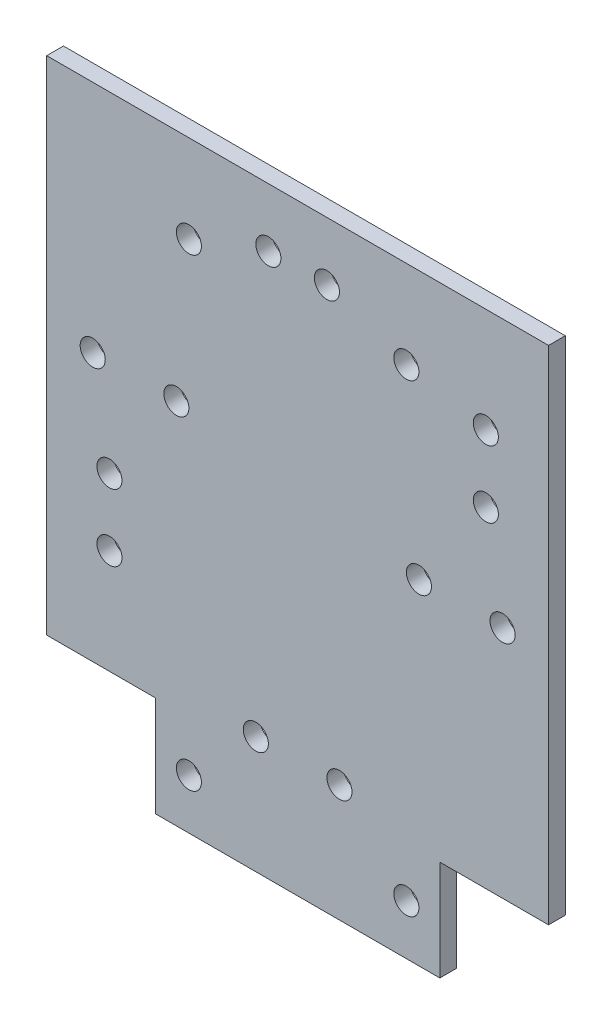
ISO-10303-21;
HEADER;
FILE_DESCRIPTION(('STEP AP214'),'2;1');
FILE_NAME('part.step','',(''),(''),'','','');
FILE_SCHEMA(('AUTOMOTIVE_DESIGN { 1 0 10303 214 1 1 1 1 }'));
ENDSEC;
DATA;
#1=APPLICATION_CONTEXT('core data for automotive mechanical design processes');
#2=APPLICATION_PROTOCOL_DEFINITION('international standard','automotive_design',2000,#1);
#3=PRODUCT_CONTEXT('',#1,'mechanical');
#4=PRODUCT('Part','Part','',(#3));
#5=PRODUCT_RELATED_PRODUCT_CATEGORY('part','',(#4));
#6=PRODUCT_DEFINITION_FORMATION('','',#4);
#7=PRODUCT_DEFINITION_CONTEXT('part definition',#1,'design');
#8=PRODUCT_DEFINITION('design','',#6,#7);
#9=PRODUCT_DEFINITION_SHAPE('','',#8);
#10=(LENGTH_UNIT() NAMED_UNIT(*) SI_UNIT(.MILLI.,.METRE.));
#11=(NAMED_UNIT(*) PLANE_ANGLE_UNIT() SI_UNIT($,.RADIAN.));
#12=(NAMED_UNIT(*) SI_UNIT($,.STERADIAN.) SOLID_ANGLE_UNIT());
#13=UNCERTAINTY_MEASURE_WITH_UNIT(LENGTH_MEASURE(1.E-05),#10,'distance_accuracy_value','');
#14=(GEOMETRIC_REPRESENTATION_CONTEXT(3) GLOBAL_UNCERTAINTY_ASSIGNED_CONTEXT((#13)) GLOBAL_UNIT_ASSIGNED_CONTEXT((#10,
#11,#12)) REPRESENTATION_CONTEXT('',''));
#15=CARTESIAN_POINT('',(0.,0.,0.));
#16=DIRECTION('',(0.,0.,1.));
#17=DIRECTION('',(1.,0.,0.));
#18=AXIS2_PLACEMENT_3D('',#15,#16,#17);
#19=CARTESIAN_POINT('',(5.26420796520805,-45.9554736842105,2.));
#20=DIRECTION('',(0.,0.,1.));
#21=DIRECTION('',(1.,0.,0.));
#22=AXIS2_PLACEMENT_3D('',#19,#20,#21);
#23=PLANE('',#22);
#24=CARTESIAN_POINT('',(20.764207965208,-13.9554736842105,2.));
#25=DIRECTION('',(0.,0.,1.));
#26=DIRECTION('',(1.,0.,0.));
#27=AXIS2_PLACEMENT_3D('',#24,#25,#26);
#28=CIRCLE('',#27,1.5);
#29=CARTESIAN_POINT('',(22.264207965208,-13.9554736842105,2.));
#30=VERTEX_POINT('',#29);
#31=EDGE_CURVE('E258',#30,#30,#28,.T.);
#32=ORIENTED_EDGE('',*,*,#31,.F.);
#33=EDGE_LOOP('',(#32));
#34=FACE_BOUND('',#33,.T.);
#35=CARTESIAN_POINT('',(22.2642079652081,-51.9554736842105,2.));
#36=DIRECTION('',(0.,0.,1.));
#37=DIRECTION('',(1.,0.,0.));
#38=AXIS2_PLACEMENT_3D('',#35,#36,#37);
#39=CIRCLE('',#38,1.5);
#40=CARTESIAN_POINT('',(23.7642079652081,-51.9554736842105,2.));
#41=VERTEX_POINT('',#40);
#42=EDGE_CURVE('E246',#41,#41,#39,.T.);
#43=ORIENTED_EDGE('',*,*,#42,.F.);
#44=EDGE_LOOP('',(#43));
#45=FACE_BOUND('',#44,.T.);
#46=CARTESIAN_POINT('',(49.764207965208,-17.9554736842105,2.));
#47=DIRECTION('',(0.,0.,1.));
#48=DIRECTION('',(1.,0.,0.));
#49=AXIS2_PLACEMENT_3D('',#46,#47,#48);
#50=CIRCLE('',#49,1.5);
#51=CARTESIAN_POINT('',(51.264207965208,-17.9554736842105,2.));
#52=VERTEX_POINT('',#51);
#53=EDGE_CURVE('E234',#52,#52,#50,.T.);
#54=ORIENTED_EDGE('',*,*,#53,.F.);
#55=EDGE_LOOP('',(#54));
#56=FACE_BOUND('',#55,.T.);
#57=CARTESIAN_POINT('',(22.264207965208,3.54452631578948,2.));
#58=DIRECTION('',(0.,0.,1.));
#59=DIRECTION('',(1.,0.,0.));
#60=AXIS2_PLACEMENT_3D('',#57,#58,#59);
#61=CIRCLE('',#60,1.50000000000002);
#62=CARTESIAN_POINT('',(23.7642079652081,3.54452631578948,2.));
#63=VERTEX_POINT('',#62);
#64=EDGE_CURVE('E222',#63,#63,#61,.T.);
#65=ORIENTED_EDGE('',*,*,#64,.F.);
#66=EDGE_LOOP('',(#65));
#67=FACE_BOUND('',#66,.T.);
#68=CARTESIAN_POINT('',(31.764207965208,7.04452631578948,2.));
#69=DIRECTION('',(0.,0.,1.));
#70=DIRECTION('',(1.,0.,0.));
#71=AXIS2_PLACEMENT_3D('',#68,#69,#70);
#72=CIRCLE('',#71,1.5);
#73=CARTESIAN_POINT('',(33.264207965208,7.04452631578948,2.));
#74=VERTEX_POINT('',#73);
#75=EDGE_CURVE('E210',#74,#74,#72,.T.);
#76=ORIENTED_EDGE('',*,*,#75,.F.);
#77=EDGE_LOOP('',(#76));
#78=FACE_BOUND('',#77,.T.);
#79=CARTESIAN_POINT('',(40.2642079652081,-43.9554736842105,2.));
#80=DIRECTION('',(0.,0.,1.));
#81=DIRECTION('',(1.,0.,0.));
#82=AXIS2_PLACEMENT_3D('',#79,#80,#81);
#83=CIRCLE('',#82,1.50000000000001);
#84=CARTESIAN_POINT('',(41.7642079652081,-43.9554736842105,2.));
#85=VERTEX_POINT('',#84);
#86=EDGE_CURVE('E198',#85,#85,#83,.T.);
#87=ORIENTED_EDGE('',*,*,#86,.F.);
#88=EDGE_LOOP('',(#87));
#89=FACE_BOUND('',#88,.T.);
#90=CARTESIAN_POINT('',(12.7642079652081,-33.4554736842105,2.));
#91=DIRECTION('',(0.,0.,1.));
#92=DIRECTION('',(1.,0.,0.));
#93=AXIS2_PLACEMENT_3D('',#90,#91,#92);
#94=CIRCLE('',#93,1.5);
#95=CARTESIAN_POINT('',(14.2642079652081,-33.4554736842105,2.));
#96=VERTEX_POINT('',#95);
#97=EDGE_CURVE('E186',#96,#96,#94,.T.);
#98=ORIENTED_EDGE('',*,*,#97,.F.);
#99=EDGE_LOOP('',(#98));
#100=FACE_BOUND('',#99,.T.);
#101=CARTESIAN_POINT('',(57.764207965208,1.54452631578949,2.));
#102=DIRECTION('',(0.,0.,1.));
#103=DIRECTION('',(1.,0.,0.));
#104=AXIS2_PLACEMENT_3D('',#101,#102,#103);
#105=CIRCLE('',#104,1.5);
#106=CARTESIAN_POINT('',(59.264207965208,1.54452631578949,2.));
#107=VERTEX_POINT('',#106);
#108=EDGE_CURVE('E132',#107,#107,#105,.T.);
#109=ORIENTED_EDGE('',*,*,#108,.F.);
#110=EDGE_LOOP('',(#109));
#111=FACE_BOUND('',#110,.T.);
#112=DIRECTION('',(0.,-1.,0.));
#113=VECTOR('',#112,1.);
#114=CARTESIAN_POINT('',(5.26420796520805,14.0445263157895,2.));
#115=LINE('',#114,#113);
#116=CARTESIAN_POINT('',(5.26420796520805,14.0445263157895,2.));
#117=VERTEX_POINT('',#116);
#118=CARTESIAN_POINT('',(5.26420796520805,-45.9554736842105,2.));
#119=VERTEX_POINT('',#118);
#120=EDGE_CURVE('E143',#117,#119,#115,.T.);
#121=ORIENTED_EDGE('',*,*,#120,.T.);
#122=DIRECTION('',(1.,0.,0.));
#123=VECTOR('',#122,1.);
#124=CARTESIAN_POINT('',(5.26420796520805,-45.9554736842105,2.));
#125=LINE('',#124,#123);
#126=CARTESIAN_POINT('',(18.2642079652081,-45.9554736842105,2.));
#127=VERTEX_POINT('',#126);
#128=EDGE_CURVE('E91',#119,#127,#125,.T.);
#129=ORIENTED_EDGE('',*,*,#128,.T.);
#130=DIRECTION('',(0.,-1.,0.));
#131=VECTOR('',#130,1.);
#132=CARTESIAN_POINT('',(18.2642079652081,-57.9554736842105,2.));
#133=LINE('',#132,#131);
#134=CARTESIAN_POINT('',(18.2642079652081,-57.9554736842105,2.));
#135=VERTEX_POINT('',#134);
#136=EDGE_CURVE('E158',#127,#135,#133,.T.);
#137=ORIENTED_EDGE('',*,*,#136,.T.);
#138=DIRECTION('',(1.,0.,0.));
#139=VECTOR('',#138,1.);
#140=CARTESIAN_POINT('',(18.2642079652081,-57.9554736842105,2.));
#141=LINE('',#140,#139);
#142=CARTESIAN_POINT('',(52.2642079652081,-57.9554736842105,2.));
#143=VERTEX_POINT('',#142);
#144=EDGE_CURVE('E171',#135,#143,#141,.T.);
#145=ORIENTED_EDGE('',*,*,#144,.T.);
#146=DIRECTION('',(0.,1.,0.));
#147=VECTOR('',#146,1.);
#148=CARTESIAN_POINT('',(52.2642079652081,-57.9554736842105,2.));
#149=LINE('',#148,#147);
#150=CARTESIAN_POINT('',(52.264207965208,-45.9554736842105,2.));
#151=VERTEX_POINT('',#150);
#152=EDGE_CURVE('E110',#143,#151,#149,.T.);
#153=ORIENTED_EDGE('',*,*,#152,.T.);
#154=DIRECTION('',(1.,0.,0.));
#155=VECTOR('',#154,1.);
#156=CARTESIAN_POINT('',(65.264207965208,-45.9554736842105,2.));
#157=LINE('',#156,#155);
#158=CARTESIAN_POINT('',(65.264207965208,-45.9554736842105,2.));
#159=VERTEX_POINT('',#158);
#160=EDGE_CURVE('E104',#151,#159,#157,.T.);
#161=ORIENTED_EDGE('',*,*,#160,.T.);
#162=DIRECTION('',(0.,1.,0.));
#163=VECTOR('',#162,1.);
#164=CARTESIAN_POINT('',(65.264207965208,14.0445263157895,2.));
#165=LINE('',#164,#163);
#166=CARTESIAN_POINT('',(65.264207965208,14.0445263157895,2.));
#167=VERTEX_POINT('',#166);
#168=EDGE_CURVE('E108',#159,#167,#165,.T.);
#169=ORIENTED_EDGE('',*,*,#168,.T.);
#170=DIRECTION('',(-1.,0.,0.));
#171=VECTOR('',#170,1.);
#172=CARTESIAN_POINT('',(5.26420796520805,14.0445263157895,2.));
#173=LINE('',#172,#171);
#174=EDGE_CURVE('E48',#167,#117,#173,.T.);
#175=ORIENTED_EDGE('',*,*,#174,.T.);
#176=EDGE_LOOP('',(#121,#129,#137,#145,#153,#161,#169,#175));
#177=FACE_BOUND('',#176,.T.);
#178=CARTESIAN_POINT('',(57.7642079652081,-6.45547368421051,2.));
#179=DIRECTION('',(0.,0.,1.));
#180=DIRECTION('',(1.,0.,0.));
#181=AXIS2_PLACEMENT_3D('',#178,#179,#180);
#182=CIRCLE('',#181,1.5);
#183=CARTESIAN_POINT('',(59.2642079652081,-6.45547368421051,2.));
#184=VERTEX_POINT('',#183);
#185=EDGE_CURVE('E180',#184,#184,#182,.T.);
#186=ORIENTED_EDGE('',*,*,#185,.F.);
#187=EDGE_LOOP('',(#186));
#188=FACE_BOUND('',#187,.T.);
#189=CARTESIAN_POINT('',(12.7642079652081,-25.4554736842105,2.));
#190=DIRECTION('',(0.,0.,1.));
#191=DIRECTION('',(1.,0.,0.));
#192=AXIS2_PLACEMENT_3D('',#189,#190,#191);
#193=CIRCLE('',#192,1.5);
#194=CARTESIAN_POINT('',(14.2642079652081,-25.4554736842105,2.));
#195=VERTEX_POINT('',#194);
#196=EDGE_CURVE('E192',#195,#195,#193,.T.);
#197=ORIENTED_EDGE('',*,*,#196,.F.);
#198=EDGE_LOOP('',(#197));
#199=FACE_BOUND('',#198,.T.);
#200=CARTESIAN_POINT('',(30.264207965208,-43.9554736842105,2.));
#201=DIRECTION('',(0.,0.,1.));
#202=DIRECTION('',(1.,0.,0.));
#203=AXIS2_PLACEMENT_3D('',#200,#201,#202);
#204=CIRCLE('',#203,1.5);
#205=CARTESIAN_POINT('',(31.764207965208,-43.9554736842105,2.));
#206=VERTEX_POINT('',#205);
#207=EDGE_CURVE('E204',#206,#206,#204,.T.);
#208=ORIENTED_EDGE('',*,*,#207,.F.);
#209=EDGE_LOOP('',(#208));
#210=FACE_BOUND('',#209,.T.);
#211=CARTESIAN_POINT('',(38.764207965208,7.04452631578948,2.));
#212=DIRECTION('',(0.,0.,1.));
#213=DIRECTION('',(1.,0.,0.));
#214=AXIS2_PLACEMENT_3D('',#211,#212,#213);
#215=CIRCLE('',#214,1.5);
#216=CARTESIAN_POINT('',(40.264207965208,7.04452631578948,2.));
#217=VERTEX_POINT('',#216);
#218=EDGE_CURVE('E216',#217,#217,#215,.T.);
#219=ORIENTED_EDGE('',*,*,#218,.F.);
#220=EDGE_LOOP('',(#219));
#221=FACE_BOUND('',#220,.T.);
#222=CARTESIAN_POINT('',(48.264207965208,3.54452631578948,2.));
#223=DIRECTION('',(0.,0.,1.));
#224=DIRECTION('',(1.,0.,0.));
#225=AXIS2_PLACEMENT_3D('',#222,#223,#224);
#226=CIRCLE('',#225,1.50000000000002);
#227=CARTESIAN_POINT('',(49.7642079652081,3.54452631578948,2.));
#228=VERTEX_POINT('',#227);
#229=EDGE_CURVE('E228',#228,#228,#226,.T.);
#230=ORIENTED_EDGE('',*,*,#229,.F.);
#231=EDGE_LOOP('',(#230));
#232=FACE_BOUND('',#231,.T.);
#233=CARTESIAN_POINT('',(48.2642079652081,-51.9554736842105,2.));
#234=DIRECTION('',(0.,0.,1.));
#235=DIRECTION('',(1.,0.,0.));
#236=AXIS2_PLACEMENT_3D('',#233,#234,#235);
#237=CIRCLE('',#236,1.5);
#238=CARTESIAN_POINT('',(49.7642079652081,-51.9554736842105,2.));
#239=VERTEX_POINT('',#238);
#240=EDGE_CURVE('E240',#239,#239,#237,.T.);
#241=ORIENTED_EDGE('',*,*,#240,.F.);
#242=EDGE_LOOP('',(#241));
#243=FACE_BOUND('',#242,.T.);
#244=CARTESIAN_POINT('',(59.764207965208,-17.9554736842105,2.));
#245=DIRECTION('',(0.,0.,1.));
#246=DIRECTION('',(1.,0.,0.));
#247=AXIS2_PLACEMENT_3D('',#244,#245,#246);
#248=CIRCLE('',#247,1.5);
#249=CARTESIAN_POINT('',(61.264207965208,-17.9554736842105,2.));
#250=VERTEX_POINT('',#249);
#251=EDGE_CURVE('E252',#250,#250,#248,.T.);
#252=ORIENTED_EDGE('',*,*,#251,.F.);
#253=EDGE_LOOP('',(#252));
#254=FACE_BOUND('',#253,.T.);
#255=CARTESIAN_POINT('',(10.764207965208,-13.9554736842105,2.));
#256=DIRECTION('',(0.,0.,1.));
#257=DIRECTION('',(1.,0.,0.));
#258=AXIS2_PLACEMENT_3D('',#255,#256,#257);
#259=CIRCLE('',#258,1.5);
#260=CARTESIAN_POINT('',(12.264207965208,-13.9554736842105,2.));
#261=VERTEX_POINT('',#260);
#262=EDGE_CURVE('E264',#261,#261,#259,.T.);
#263=ORIENTED_EDGE('',*,*,#262,.F.);
#264=EDGE_LOOP('',(#263));
#265=FACE_BOUND('',#264,.T.);
#266=ADVANCED_FACE('F31',(#34,#45,#56,#67,#78,#89,#100,#111,#177,#188,#199,#210,#221,#232,#243,
#254,#265),#23,.T.);
#267=CARTESIAN_POINT('',(5.26420796520805,-45.9554736842105,0.));
#268=DIRECTION('',(0.,0.,1.));
#269=DIRECTION('',(1.,0.,0.));
#270=AXIS2_PLACEMENT_3D('',#267,#268,#269);
#271=PLANE('',#270);
#272=CARTESIAN_POINT('',(20.764207965208,-13.9554736842105,0.));
#273=DIRECTION('',(0.,0.,1.));
#274=DIRECTION('',(1.,0.,0.));
#275=AXIS2_PLACEMENT_3D('',#272,#273,#274);
#276=CIRCLE('',#275,1.5);
#277=CARTESIAN_POINT('',(22.264207965208,-13.9554736842105,0.));
#278=VERTEX_POINT('',#277);
#279=EDGE_CURVE('E261',#278,#278,#276,.T.);
#280=ORIENTED_EDGE('',*,*,#279,.T.);
#281=EDGE_LOOP('',(#280));
#282=FACE_BOUND('',#281,.T.);
#283=CARTESIAN_POINT('',(22.2642079652081,-51.9554736842105,0.));
#284=DIRECTION('',(0.,0.,1.));
#285=DIRECTION('',(1.,0.,0.));
#286=AXIS2_PLACEMENT_3D('',#283,#284,#285);
#287=CIRCLE('',#286,1.5);
#288=CARTESIAN_POINT('',(23.7642079652081,-51.9554736842105,0.));
#289=VERTEX_POINT('',#288);
#290=EDGE_CURVE('E249',#289,#289,#287,.T.);
#291=ORIENTED_EDGE('',*,*,#290,.T.);
#292=EDGE_LOOP('',(#291));
#293=FACE_BOUND('',#292,.T.);
#294=CARTESIAN_POINT('',(49.764207965208,-17.9554736842105,0.));
#295=DIRECTION('',(0.,0.,1.));
#296=DIRECTION('',(1.,0.,0.));
#297=AXIS2_PLACEMENT_3D('',#294,#295,#296);
#298=CIRCLE('',#297,1.5);
#299=CARTESIAN_POINT('',(51.264207965208,-17.9554736842105,0.));
#300=VERTEX_POINT('',#299);
#301=EDGE_CURVE('E237',#300,#300,#298,.T.);
#302=ORIENTED_EDGE('',*,*,#301,.T.);
#303=EDGE_LOOP('',(#302));
#304=FACE_BOUND('',#303,.T.);
#305=CARTESIAN_POINT('',(22.264207965208,3.54452631578948,0.));
#306=DIRECTION('',(0.,0.,1.));
#307=DIRECTION('',(1.,0.,0.));
#308=AXIS2_PLACEMENT_3D('',#305,#306,#307);
#309=CIRCLE('',#308,1.50000000000002);
#310=CARTESIAN_POINT('',(23.7642079652081,3.54452631578948,0.));
#311=VERTEX_POINT('',#310);
#312=EDGE_CURVE('E225',#311,#311,#309,.T.);
#313=ORIENTED_EDGE('',*,*,#312,.T.);
#314=EDGE_LOOP('',(#313));
#315=FACE_BOUND('',#314,.T.);
#316=CARTESIAN_POINT('',(31.764207965208,7.04452631578948,0.));
#317=DIRECTION('',(0.,0.,1.));
#318=DIRECTION('',(1.,0.,0.));
#319=AXIS2_PLACEMENT_3D('',#316,#317,#318);
#320=CIRCLE('',#319,1.5);
#321=CARTESIAN_POINT('',(33.264207965208,7.04452631578948,0.));
#322=VERTEX_POINT('',#321);
#323=EDGE_CURVE('E213',#322,#322,#320,.T.);
#324=ORIENTED_EDGE('',*,*,#323,.T.);
#325=EDGE_LOOP('',(#324));
#326=FACE_BOUND('',#325,.T.);
#327=CARTESIAN_POINT('',(40.2642079652081,-43.9554736842105,0.));
#328=DIRECTION('',(0.,0.,1.));
#329=DIRECTION('',(1.,0.,0.));
#330=AXIS2_PLACEMENT_3D('',#327,#328,#329);
#331=CIRCLE('',#330,1.50000000000001);
#332=CARTESIAN_POINT('',(41.7642079652081,-43.9554736842105,0.));
#333=VERTEX_POINT('',#332);
#334=EDGE_CURVE('E201',#333,#333,#331,.T.);
#335=ORIENTED_EDGE('',*,*,#334,.T.);
#336=EDGE_LOOP('',(#335));
#337=FACE_BOUND('',#336,.T.);
#338=CARTESIAN_POINT('',(12.7642079652081,-33.4554736842105,0.));
#339=DIRECTION('',(0.,0.,1.));
#340=DIRECTION('',(1.,0.,0.));
#341=AXIS2_PLACEMENT_3D('',#338,#339,#340);
#342=CIRCLE('',#341,1.5);
#343=CARTESIAN_POINT('',(14.2642079652081,-33.4554736842105,0.));
#344=VERTEX_POINT('',#343);
#345=EDGE_CURVE('E189',#344,#344,#342,.T.);
#346=ORIENTED_EDGE('',*,*,#345,.T.);
#347=EDGE_LOOP('',(#346));
#348=FACE_BOUND('',#347,.T.);
#349=CARTESIAN_POINT('',(57.764207965208,1.54452631578949,0.));
#350=DIRECTION('',(0.,0.,1.));
#351=DIRECTION('',(1.,0.,0.));
#352=AXIS2_PLACEMENT_3D('',#349,#350,#351);
#353=CIRCLE('',#352,1.5);
#354=CARTESIAN_POINT('',(59.264207965208,1.54452631578949,0.));
#355=VERTEX_POINT('',#354);
#356=EDGE_CURVE('E177',#355,#355,#353,.T.);
#357=ORIENTED_EDGE('',*,*,#356,.T.);
#358=EDGE_LOOP('',(#357));
#359=FACE_BOUND('',#358,.T.);
#360=DIRECTION('',(0.,-1.,0.));
#361=VECTOR('',#360,1.);
#362=CARTESIAN_POINT('',(5.26420796520805,14.0445263157895,0.));
#363=LINE('',#362,#361);
#364=CARTESIAN_POINT('',(5.26420796520805,14.0445263157895,0.));
#365=VERTEX_POINT('',#364);
#366=CARTESIAN_POINT('',(5.26420796520805,-45.9554736842105,0.));
#367=VERTEX_POINT('',#366);
#368=EDGE_CURVE('E128',#365,#367,#363,.T.);
#369=ORIENTED_EDGE('',*,*,#368,.F.);
#370=DIRECTION('',(-1.,0.,0.));
#371=VECTOR('',#370,1.);
#372=CARTESIAN_POINT('',(5.26420796520805,14.0445263157895,0.));
#373=LINE('',#372,#371);
#374=CARTESIAN_POINT('',(65.264207965208,14.0445263157895,0.));
#375=VERTEX_POINT('',#374);
#376=EDGE_CURVE('E83',#375,#365,#373,.T.);
#377=ORIENTED_EDGE('',*,*,#376,.F.);
#378=DIRECTION('',(0.,1.,0.));
#379=VECTOR('',#378,1.);
#380=CARTESIAN_POINT('',(65.264207965208,14.0445263157895,0.));
#381=LINE('',#380,#379);
#382=CARTESIAN_POINT('',(65.264207965208,-45.9554736842105,0.));
#383=VERTEX_POINT('',#382);
#384=EDGE_CURVE('E77',#383,#375,#381,.T.);
#385=ORIENTED_EDGE('',*,*,#384,.F.);
#386=DIRECTION('',(1.,0.,0.));
#387=VECTOR('',#386,1.);
#388=CARTESIAN_POINT('',(65.264207965208,-45.9554736842105,0.));
#389=LINE('',#388,#387);
#390=CARTESIAN_POINT('',(52.264207965208,-45.9554736842105,0.));
#391=VERTEX_POINT('',#390);
#392=EDGE_CURVE('E118',#391,#383,#389,.T.);
#393=ORIENTED_EDGE('',*,*,#392,.F.);
#394=DIRECTION('',(0.,1.,0.));
#395=VECTOR('',#394,1.);
#396=CARTESIAN_POINT('',(52.2642079652081,-57.9554736842105,0.));
#397=LINE('',#396,#395);
#398=CARTESIAN_POINT('',(52.2642079652081,-57.9554736842105,0.));
#399=VERTEX_POINT('',#398);
#400=EDGE_CURVE('E138',#399,#391,#397,.T.);
#401=ORIENTED_EDGE('',*,*,#400,.F.);
#402=DIRECTION('',(1.,0.,0.));
#403=VECTOR('',#402,1.);
#404=CARTESIAN_POINT('',(18.2642079652081,-57.9554736842105,0.));
#405=LINE('',#404,#403);
#406=CARTESIAN_POINT('',(18.2642079652081,-57.9554736842105,0.));
#407=VERTEX_POINT('',#406);
#408=EDGE_CURVE('E136',#407,#399,#405,.T.);
#409=ORIENTED_EDGE('',*,*,#408,.F.);
#410=DIRECTION('',(0.,-1.,0.));
#411=VECTOR('',#410,1.);
#412=CARTESIAN_POINT('',(18.2642079652081,-57.9554736842105,0.));
#413=LINE('',#412,#411);
#414=CARTESIAN_POINT('',(18.2642079652081,-45.9554736842105,0.));
#415=VERTEX_POINT('',#414);
#416=EDGE_CURVE('E134',#415,#407,#413,.T.);
#417=ORIENTED_EDGE('',*,*,#416,.F.);
#418=DIRECTION('',(1.,0.,0.));
#419=VECTOR('',#418,1.);
#420=CARTESIAN_POINT('',(5.26420796520805,-45.9554736842105,0.));
#421=LINE('',#420,#419);
#422=EDGE_CURVE('E131',#367,#415,#421,.T.);
#423=ORIENTED_EDGE('',*,*,#422,.F.);
#424=EDGE_LOOP('',(#369,#377,#385,#393,#401,#409,#417,#423));
#425=FACE_BOUND('',#424,.T.);
#426=CARTESIAN_POINT('',(57.7642079652081,-6.45547368421051,0.));
#427=DIRECTION('',(0.,0.,1.));
#428=DIRECTION('',(1.,0.,0.));
#429=AXIS2_PLACEMENT_3D('',#426,#427,#428);
#430=CIRCLE('',#429,1.5);
#431=CARTESIAN_POINT('',(59.2642079652081,-6.45547368421051,0.));
#432=VERTEX_POINT('',#431);
#433=EDGE_CURVE('E183',#432,#432,#430,.T.);
#434=ORIENTED_EDGE('',*,*,#433,.T.);
#435=EDGE_LOOP('',(#434));
#436=FACE_BOUND('',#435,.T.);
#437=CARTESIAN_POINT('',(12.7642079652081,-25.4554736842105,0.));
#438=DIRECTION('',(0.,0.,1.));
#439=DIRECTION('',(1.,0.,0.));
#440=AXIS2_PLACEMENT_3D('',#437,#438,#439);
#441=CIRCLE('',#440,1.5);
#442=CARTESIAN_POINT('',(14.2642079652081,-25.4554736842105,0.));
#443=VERTEX_POINT('',#442);
#444=EDGE_CURVE('E195',#443,#443,#441,.T.);
#445=ORIENTED_EDGE('',*,*,#444,.T.);
#446=EDGE_LOOP('',(#445));
#447=FACE_BOUND('',#446,.T.);
#448=CARTESIAN_POINT('',(30.264207965208,-43.9554736842105,0.));
#449=DIRECTION('',(0.,0.,1.));
#450=DIRECTION('',(1.,0.,0.));
#451=AXIS2_PLACEMENT_3D('',#448,#449,#450);
#452=CIRCLE('',#451,1.5);
#453=CARTESIAN_POINT('',(31.764207965208,-43.9554736842105,0.));
#454=VERTEX_POINT('',#453);
#455=EDGE_CURVE('E207',#454,#454,#452,.T.);
#456=ORIENTED_EDGE('',*,*,#455,.T.);
#457=EDGE_LOOP('',(#456));
#458=FACE_BOUND('',#457,.T.);
#459=CARTESIAN_POINT('',(38.764207965208,7.04452631578948,0.));
#460=DIRECTION('',(0.,0.,1.));
#461=DIRECTION('',(1.,0.,0.));
#462=AXIS2_PLACEMENT_3D('',#459,#460,#461);
#463=CIRCLE('',#462,1.5);
#464=CARTESIAN_POINT('',(40.264207965208,7.04452631578948,0.));
#465=VERTEX_POINT('',#464);
#466=EDGE_CURVE('E219',#465,#465,#463,.T.);
#467=ORIENTED_EDGE('',*,*,#466,.T.);
#468=EDGE_LOOP('',(#467));
#469=FACE_BOUND('',#468,.T.);
#470=CARTESIAN_POINT('',(48.264207965208,3.54452631578948,0.));
#471=DIRECTION('',(0.,0.,1.));
#472=DIRECTION('',(1.,0.,0.));
#473=AXIS2_PLACEMENT_3D('',#470,#471,#472);
#474=CIRCLE('',#473,1.50000000000002);
#475=CARTESIAN_POINT('',(49.7642079652081,3.54452631578948,0.));
#476=VERTEX_POINT('',#475);
#477=EDGE_CURVE('E231',#476,#476,#474,.T.);
#478=ORIENTED_EDGE('',*,*,#477,.T.);
#479=EDGE_LOOP('',(#478));
#480=FACE_BOUND('',#479,.T.);
#481=CARTESIAN_POINT('',(48.2642079652081,-51.9554736842105,0.));
#482=DIRECTION('',(0.,0.,1.));
#483=DIRECTION('',(1.,0.,0.));
#484=AXIS2_PLACEMENT_3D('',#481,#482,#483);
#485=CIRCLE('',#484,1.5);
#486=CARTESIAN_POINT('',(49.7642079652081,-51.9554736842105,0.));
#487=VERTEX_POINT('',#486);
#488=EDGE_CURVE('E243',#487,#487,#485,.T.);
#489=ORIENTED_EDGE('',*,*,#488,.T.);
#490=EDGE_LOOP('',(#489));
#491=FACE_BOUND('',#490,.T.);
#492=CARTESIAN_POINT('',(59.764207965208,-17.9554736842105,0.));
#493=DIRECTION('',(0.,0.,1.));
#494=DIRECTION('',(1.,0.,0.));
#495=AXIS2_PLACEMENT_3D('',#492,#493,#494);
#496=CIRCLE('',#495,1.5);
#497=CARTESIAN_POINT('',(61.264207965208,-17.9554736842105,0.));
#498=VERTEX_POINT('',#497);
#499=EDGE_CURVE('E255',#498,#498,#496,.T.);
#500=ORIENTED_EDGE('',*,*,#499,.T.);
#501=EDGE_LOOP('',(#500));
#502=FACE_BOUND('',#501,.T.);
#503=CARTESIAN_POINT('',(10.764207965208,-13.9554736842105,0.));
#504=DIRECTION('',(0.,0.,1.));
#505=DIRECTION('',(1.,0.,0.));
#506=AXIS2_PLACEMENT_3D('',#503,#504,#505);
#507=CIRCLE('',#506,1.5);
#508=CARTESIAN_POINT('',(12.264207965208,-13.9554736842105,0.));
#509=VERTEX_POINT('',#508);
#510=EDGE_CURVE('E267',#509,#509,#507,.T.);
#511=ORIENTED_EDGE('',*,*,#510,.T.);
#512=EDGE_LOOP('',(#511));
#513=FACE_BOUND('',#512,.T.);
#514=ADVANCED_FACE('F162',(#282,#293,#304,#315,#326,#337,#348,#359,#425,#436,#447,#458,#469,
#480,#491,#502,#513),#271,.F.);
#515=CARTESIAN_POINT('',(5.26420796520805,14.0445263157895,2.));
#516=DIRECTION('',(1.,0.,0.));
#517=DIRECTION('',(0.,1.,0.));
#518=AXIS2_PLACEMENT_3D('',#515,#516,#517);
#519=PLANE('',#518);
#520=ORIENTED_EDGE('',*,*,#368,.T.);
#521=DIRECTION('',(0.,0.,-1.));
#522=VECTOR('',#521,1.);
#523=CARTESIAN_POINT('',(5.26420796520805,-45.9554736842105,2.));
#524=LINE('',#523,#522);
#525=EDGE_CURVE('E11',#119,#367,#524,.T.);
#526=ORIENTED_EDGE('',*,*,#525,.F.);
#527=ORIENTED_EDGE('',*,*,#120,.F.);
#528=DIRECTION('',(0.,0.,-1.));
#529=VECTOR('',#528,1.);
#530=CARTESIAN_POINT('',(5.26420796520805,14.0445263157895,2.));
#531=LINE('',#530,#529);
#532=EDGE_CURVE('E124',#117,#365,#531,.T.);
#533=ORIENTED_EDGE('',*,*,#532,.T.);
#534=EDGE_LOOP('',(#520,#526,#527,#533));
#535=FACE_BOUND('',#534,.T.);
#536=ADVANCED_FACE('F33',(#535),#519,.F.);
#537=CARTESIAN_POINT('',(5.26420796520805,-45.9554736842105,2.));
#538=DIRECTION('',(0.,1.,0.));
#539=DIRECTION('',(0.,0.,1.));
#540=AXIS2_PLACEMENT_3D('',#537,#538,#539);
#541=PLANE('',#540);
#542=ORIENTED_EDGE('',*,*,#422,.T.);
#543=DIRECTION('',(0.,0.,-1.));
#544=VECTOR('',#543,1.);
#545=CARTESIAN_POINT('',(18.2642079652081,-45.9554736842105,2.));
#546=LINE('',#545,#544);
#547=EDGE_CURVE('E40',#127,#415,#546,.T.);
#548=ORIENTED_EDGE('',*,*,#547,.F.);
#549=ORIENTED_EDGE('',*,*,#128,.F.);
#550=ORIENTED_EDGE('',*,*,#525,.T.);
#551=EDGE_LOOP('',(#542,#548,#549,#550));
#552=FACE_BOUND('',#551,.T.);
#553=ADVANCED_FACE('F302',(#552),#541,.F.);
#554=CARTESIAN_POINT('',(18.2642079652081,-57.9554736842105,2.));
#555=DIRECTION('',(1.,0.,0.));
#556=DIRECTION('',(0.,0.,-1.));
#557=AXIS2_PLACEMENT_3D('',#554,#555,#556);
#558=PLANE('',#557);
#559=ORIENTED_EDGE('',*,*,#416,.T.);
#560=DIRECTION('',(0.,0.,-1.));
#561=VECTOR('',#560,1.);
#562=CARTESIAN_POINT('',(18.2642079652081,-57.9554736842105,2.));
#563=LINE('',#562,#561);
#564=EDGE_CURVE('E150',#135,#407,#563,.T.);
#565=ORIENTED_EDGE('',*,*,#564,.F.);
#566=ORIENTED_EDGE('',*,*,#136,.F.);
#567=ORIENTED_EDGE('',*,*,#547,.T.);
#568=EDGE_LOOP('',(#559,#565,#566,#567));
#569=FACE_BOUND('',#568,.T.);
#570=ADVANCED_FACE('F156',(#569),#558,.F.);
#571=CARTESIAN_POINT('',(18.2642079652081,-57.9554736842105,2.));
#572=DIRECTION('',(0.,1.,0.));
#573=DIRECTION('',(-1.,0.,0.));
#574=AXIS2_PLACEMENT_3D('',#571,#572,#573);
#575=PLANE('',#574);
#576=ORIENTED_EDGE('',*,*,#408,.T.);
#577=DIRECTION('',(0.,0.,-1.));
#578=VECTOR('',#577,1.);
#579=CARTESIAN_POINT('',(52.2642079652081,-57.9554736842105,2.));
#580=LINE('',#579,#578);
#581=EDGE_CURVE('E147',#143,#399,#580,.T.);
#582=ORIENTED_EDGE('',*,*,#581,.F.);
#583=ORIENTED_EDGE('',*,*,#144,.F.);
#584=ORIENTED_EDGE('',*,*,#564,.T.);
#585=EDGE_LOOP('',(#576,#582,#583,#584));
#586=FACE_BOUND('',#585,.T.);
#587=ADVANCED_FACE('F167',(#586),#575,.F.);
#588=CARTESIAN_POINT('',(52.2642079652081,-57.9554736842105,2.));
#589=DIRECTION('',(-1.,0.,0.));
#590=DIRECTION('',(0.,-1.,0.));
#591=AXIS2_PLACEMENT_3D('',#588,#589,#590);
#592=PLANE('',#591);
#593=ORIENTED_EDGE('',*,*,#400,.T.);
#594=DIRECTION('',(0.,0.,-1.));
#595=VECTOR('',#594,1.);
#596=CARTESIAN_POINT('',(52.264207965208,-45.9554736842105,2.));
#597=LINE('',#596,#595);
#598=EDGE_CURVE('E119',#151,#391,#597,.T.);
#599=ORIENTED_EDGE('',*,*,#598,.F.);
#600=ORIENTED_EDGE('',*,*,#152,.F.);
#601=ORIENTED_EDGE('',*,*,#581,.T.);
#602=EDGE_LOOP('',(#593,#599,#600,#601));
#603=FACE_BOUND('',#602,.T.);
#604=ADVANCED_FACE('F170',(#603),#592,.F.);
#605=CARTESIAN_POINT('',(65.264207965208,-45.9554736842105,2.));
#606=DIRECTION('',(0.,1.,0.));
#607=DIRECTION('',(-1.,0.,0.));
#608=AXIS2_PLACEMENT_3D('',#605,#606,#607);
#609=PLANE('',#608);
#610=ORIENTED_EDGE('',*,*,#392,.T.);
#611=DIRECTION('',(0.,0.,-1.));
#612=VECTOR('',#611,1.);
#613=CARTESIAN_POINT('',(65.264207965208,-45.9554736842105,2.));
#614=LINE('',#613,#612);
#615=EDGE_CURVE('E115',#159,#383,#614,.T.);
#616=ORIENTED_EDGE('',*,*,#615,.F.);
#617=ORIENTED_EDGE('',*,*,#160,.F.);
#618=ORIENTED_EDGE('',*,*,#598,.T.);
#619=EDGE_LOOP('',(#610,#616,#617,#618));
#620=FACE_BOUND('',#619,.T.);
#621=ADVANCED_FACE('F116',(#620),#609,.F.);
#622=CARTESIAN_POINT('',(65.264207965208,14.0445263157895,2.));
#623=DIRECTION('',(-1.,0.,0.));
#624=DIRECTION('',(0.,0.,1.));
#625=AXIS2_PLACEMENT_3D('',#622,#623,#624);
#626=PLANE('',#625);
#627=ORIENTED_EDGE('',*,*,#384,.T.);
#628=DIRECTION('',(0.,0.,-1.));
#629=VECTOR('',#628,1.);
#630=CARTESIAN_POINT('',(65.264207965208,14.0445263157895,2.));
#631=LINE('',#630,#629);
#632=EDGE_CURVE('E120',#167,#375,#631,.T.);
#633=ORIENTED_EDGE('',*,*,#632,.F.);
#634=ORIENTED_EDGE('',*,*,#168,.F.);
#635=ORIENTED_EDGE('',*,*,#615,.T.);
#636=EDGE_LOOP('',(#627,#633,#634,#635));
#637=FACE_BOUND('',#636,.T.);
#638=ADVANCED_FACE('F122',(#637),#626,.F.);
#639=CARTESIAN_POINT('',(5.26420796520805,14.0445263157895,2.));
#640=DIRECTION('',(0.,-1.,0.));
#641=DIRECTION('',(1.,0.,0.));
#642=AXIS2_PLACEMENT_3D('',#639,#640,#641);
#643=PLANE('',#642);
#644=ORIENTED_EDGE('',*,*,#376,.T.);
#645=ORIENTED_EDGE('',*,*,#532,.F.);
#646=ORIENTED_EDGE('',*,*,#174,.F.);
#647=ORIENTED_EDGE('',*,*,#632,.T.);
#648=EDGE_LOOP('',(#644,#645,#646,#647));
#649=FACE_BOUND('',#648,.T.);
#650=ADVANCED_FACE('F290',(#649),#643,.F.);
#651=CARTESIAN_POINT('',(57.764207965208,1.54452631578949,2.));
#652=DIRECTION('',(0.,0.,-1.));
#653=DIRECTION('',(-1.,0.,0.));
#654=AXIS2_PLACEMENT_3D('',#651,#652,#653);
#655=CYLINDRICAL_SURFACE('',#654,1.5);
#656=ORIENTED_EDGE('',*,*,#108,.T.);
#657=EDGE_LOOP('',(#656));
#658=FACE_BOUND('',#657,.T.);
#659=ORIENTED_EDGE('',*,*,#356,.F.);
#660=EDGE_LOOP('',(#659));
#661=FACE_BOUND('',#660,.T.);
#662=ADVANCED_FACE('F287',(#658,#661),#655,.F.);
#663=CARTESIAN_POINT('',(57.7642079652081,-6.45547368421051,2.));
#664=DIRECTION('',(0.,0.,-1.));
#665=DIRECTION('',(-1.,0.,0.));
#666=AXIS2_PLACEMENT_3D('',#663,#664,#665);
#667=CYLINDRICAL_SURFACE('',#666,1.5);
#668=ORIENTED_EDGE('',*,*,#185,.T.);
#669=EDGE_LOOP('',(#668));
#670=FACE_BOUND('',#669,.T.);
#671=ORIENTED_EDGE('',*,*,#433,.F.);
#672=EDGE_LOOP('',(#671));
#673=FACE_BOUND('',#672,.T.);
#674=ADVANCED_FACE('F366',(#670,#673),#667,.F.);
#675=CARTESIAN_POINT('',(12.7642079652081,-33.4554736842105,2.));
#676=DIRECTION('',(0.,0.,-1.));
#677=DIRECTION('',(-1.,0.,0.));
#678=AXIS2_PLACEMENT_3D('',#675,#676,#677);
#679=CYLINDRICAL_SURFACE('',#678,1.5);
#680=ORIENTED_EDGE('',*,*,#97,.T.);
#681=EDGE_LOOP('',(#680));
#682=FACE_BOUND('',#681,.T.);
#683=ORIENTED_EDGE('',*,*,#345,.F.);
#684=EDGE_LOOP('',(#683));
#685=FACE_BOUND('',#684,.T.);
#686=ADVANCED_FACE('F374',(#682,#685),#679,.F.);
#687=CARTESIAN_POINT('',(12.7642079652081,-25.4554736842105,2.));
#688=DIRECTION('',(0.,0.,-1.));
#689=DIRECTION('',(-1.,0.,0.));
#690=AXIS2_PLACEMENT_3D('',#687,#688,#689);
#691=CYLINDRICAL_SURFACE('',#690,1.5);
#692=ORIENTED_EDGE('',*,*,#196,.T.);
#693=EDGE_LOOP('',(#692));
#694=FACE_BOUND('',#693,.T.);
#695=ORIENTED_EDGE('',*,*,#444,.F.);
#696=EDGE_LOOP('',(#695));
#697=FACE_BOUND('',#696,.T.);
#698=ADVANCED_FACE('F382',(#694,#697),#691,.F.);
#699=CARTESIAN_POINT('',(40.2642079652081,-43.9554736842105,2.));
#700=DIRECTION('',(0.,0.,-1.));
#701=DIRECTION('',(-1.,0.,0.));
#702=AXIS2_PLACEMENT_3D('',#699,#700,#701);
#703=CYLINDRICAL_SURFACE('',#702,1.50000000000001);
#704=ORIENTED_EDGE('',*,*,#86,.T.);
#705=EDGE_LOOP('',(#704));
#706=FACE_BOUND('',#705,.T.);
#707=ORIENTED_EDGE('',*,*,#334,.F.);
#708=EDGE_LOOP('',(#707));
#709=FACE_BOUND('',#708,.T.);
#710=ADVANCED_FACE('F391',(#706,#709),#703,.F.);
#711=CARTESIAN_POINT('',(30.264207965208,-43.9554736842105,2.));
#712=DIRECTION('',(0.,0.,-1.));
#713=DIRECTION('',(-1.,0.,0.));
#714=AXIS2_PLACEMENT_3D('',#711,#712,#713);
#715=CYLINDRICAL_SURFACE('',#714,1.5);
#716=ORIENTED_EDGE('',*,*,#207,.T.);
#717=EDGE_LOOP('',(#716));
#718=FACE_BOUND('',#717,.T.);
#719=ORIENTED_EDGE('',*,*,#455,.F.);
#720=EDGE_LOOP('',(#719));
#721=FACE_BOUND('',#720,.T.);
#722=ADVANCED_FACE('F400',(#718,#721),#715,.F.);
#723=CARTESIAN_POINT('',(31.764207965208,7.04452631578948,2.));
#724=DIRECTION('',(0.,0.,-1.));
#725=DIRECTION('',(-1.,0.,0.));
#726=AXIS2_PLACEMENT_3D('',#723,#724,#725);
#727=CYLINDRICAL_SURFACE('',#726,1.5);
#728=ORIENTED_EDGE('',*,*,#75,.T.);
#729=EDGE_LOOP('',(#728));
#730=FACE_BOUND('',#729,.T.);
#731=ORIENTED_EDGE('',*,*,#323,.F.);
#732=EDGE_LOOP('',(#731));
#733=FACE_BOUND('',#732,.T.);
#734=ADVANCED_FACE('F409',(#730,#733),#727,.F.);
#735=CARTESIAN_POINT('',(38.764207965208,7.04452631578948,2.));
#736=DIRECTION('',(0.,0.,-1.));
#737=DIRECTION('',(-1.,0.,0.));
#738=AXIS2_PLACEMENT_3D('',#735,#736,#737);
#739=CYLINDRICAL_SURFACE('',#738,1.5);
#740=ORIENTED_EDGE('',*,*,#218,.T.);
#741=EDGE_LOOP('',(#740));
#742=FACE_BOUND('',#741,.T.);
#743=ORIENTED_EDGE('',*,*,#466,.F.);
#744=EDGE_LOOP('',(#743));
#745=FACE_BOUND('',#744,.T.);
#746=ADVANCED_FACE('F418',(#742,#745),#739,.F.);
#747=CARTESIAN_POINT('',(22.264207965208,3.54452631578948,2.));
#748=DIRECTION('',(0.,0.,-1.));
#749=DIRECTION('',(-1.,0.,0.));
#750=AXIS2_PLACEMENT_3D('',#747,#748,#749);
#751=CYLINDRICAL_SURFACE('',#750,1.50000000000002);
#752=ORIENTED_EDGE('',*,*,#64,.T.);
#753=EDGE_LOOP('',(#752));
#754=FACE_BOUND('',#753,.T.);
#755=ORIENTED_EDGE('',*,*,#312,.F.);
#756=EDGE_LOOP('',(#755));
#757=FACE_BOUND('',#756,.T.);
#758=ADVANCED_FACE('F427',(#754,#757),#751,.F.);
#759=CARTESIAN_POINT('',(48.264207965208,3.54452631578948,2.));
#760=DIRECTION('',(0.,0.,-1.));
#761=DIRECTION('',(-1.,0.,0.));
#762=AXIS2_PLACEMENT_3D('',#759,#760,#761);
#763=CYLINDRICAL_SURFACE('',#762,1.50000000000002);
#764=ORIENTED_EDGE('',*,*,#229,.T.);
#765=EDGE_LOOP('',(#764));
#766=FACE_BOUND('',#765,.T.);
#767=ORIENTED_EDGE('',*,*,#477,.F.);
#768=EDGE_LOOP('',(#767));
#769=FACE_BOUND('',#768,.T.);
#770=ADVANCED_FACE('F436',(#766,#769),#763,.F.);
#771=CARTESIAN_POINT('',(49.764207965208,-17.9554736842105,2.));
#772=DIRECTION('',(0.,0.,-1.));
#773=DIRECTION('',(-1.,0.,0.));
#774=AXIS2_PLACEMENT_3D('',#771,#772,#773);
#775=CYLINDRICAL_SURFACE('',#774,1.5);
#776=ORIENTED_EDGE('',*,*,#53,.T.);
#777=EDGE_LOOP('',(#776));
#778=FACE_BOUND('',#777,.T.);
#779=ORIENTED_EDGE('',*,*,#301,.F.);
#780=EDGE_LOOP('',(#779));
#781=FACE_BOUND('',#780,.T.);
#782=ADVANCED_FACE('F445',(#778,#781),#775,.F.);
#783=CARTESIAN_POINT('',(48.2642079652081,-51.9554736842105,2.));
#784=DIRECTION('',(0.,0.,-1.));
#785=DIRECTION('',(-1.,0.,0.));
#786=AXIS2_PLACEMENT_3D('',#783,#784,#785);
#787=CYLINDRICAL_SURFACE('',#786,1.5);
#788=ORIENTED_EDGE('',*,*,#240,.T.);
#789=EDGE_LOOP('',(#788));
#790=FACE_BOUND('',#789,.T.);
#791=ORIENTED_EDGE('',*,*,#488,.F.);
#792=EDGE_LOOP('',(#791));
#793=FACE_BOUND('',#792,.T.);
#794=ADVANCED_FACE('F454',(#790,#793),#787,.F.);
#795=CARTESIAN_POINT('',(22.2642079652081,-51.9554736842105,2.));
#796=DIRECTION('',(0.,0.,-1.));
#797=DIRECTION('',(-1.,0.,0.));
#798=AXIS2_PLACEMENT_3D('',#795,#796,#797);
#799=CYLINDRICAL_SURFACE('',#798,1.5);
#800=ORIENTED_EDGE('',*,*,#42,.T.);
#801=EDGE_LOOP('',(#800));
#802=FACE_BOUND('',#801,.T.);
#803=ORIENTED_EDGE('',*,*,#290,.F.);
#804=EDGE_LOOP('',(#803));
#805=FACE_BOUND('',#804,.T.);
#806=ADVANCED_FACE('F463',(#802,#805),#799,.F.);
#807=CARTESIAN_POINT('',(59.764207965208,-17.9554736842105,2.));
#808=DIRECTION('',(0.,0.,-1.));
#809=DIRECTION('',(-1.,0.,0.));
#810=AXIS2_PLACEMENT_3D('',#807,#808,#809);
#811=CYLINDRICAL_SURFACE('',#810,1.5);
#812=ORIENTED_EDGE('',*,*,#251,.T.);
#813=EDGE_LOOP('',(#812));
#814=FACE_BOUND('',#813,.T.);
#815=ORIENTED_EDGE('',*,*,#499,.F.);
#816=EDGE_LOOP('',(#815));
#817=FACE_BOUND('',#816,.T.);
#818=ADVANCED_FACE('F472',(#814,#817),#811,.F.);
#819=CARTESIAN_POINT('',(20.764207965208,-13.9554736842105,2.));
#820=DIRECTION('',(0.,0.,-1.));
#821=DIRECTION('',(-1.,0.,0.));
#822=AXIS2_PLACEMENT_3D('',#819,#820,#821);
#823=CYLINDRICAL_SURFACE('',#822,1.5);
#824=ORIENTED_EDGE('',*,*,#31,.T.);
#825=EDGE_LOOP('',(#824));
#826=FACE_BOUND('',#825,.T.);
#827=ORIENTED_EDGE('',*,*,#279,.F.);
#828=EDGE_LOOP('',(#827));
#829=FACE_BOUND('',#828,.T.);
#830=ADVANCED_FACE('F481',(#826,#829),#823,.F.);
#831=CARTESIAN_POINT('',(10.764207965208,-13.9554736842105,2.));
#832=DIRECTION('',(0.,0.,-1.));
#833=DIRECTION('',(-1.,0.,0.));
#834=AXIS2_PLACEMENT_3D('',#831,#832,#833);
#835=CYLINDRICAL_SURFACE('',#834,1.5);
#836=ORIENTED_EDGE('',*,*,#262,.T.);
#837=EDGE_LOOP('',(#836));
#838=FACE_BOUND('',#837,.T.);
#839=ORIENTED_EDGE('',*,*,#510,.F.);
#840=EDGE_LOOP('',(#839));
#841=FACE_BOUND('',#840,.T.);
#842=ADVANCED_FACE('F273',(#838,#841),#835,.F.);
#843=CLOSED_SHELL('',(#266,#514,#536,#553,#570,#587,#604,#621,#638,#650,#662,#674,#686,#698,
#710,#722,#734,#746,#758,#770,#782,#794,#806,#818,#830,#842));
#844=MANIFOLD_SOLID_BREP('B2',#843);
#845=ADVANCED_BREP_SHAPE_REPRESENTATION('',(#18,#844),#14);
#846=SHAPE_DEFINITION_REPRESENTATION(#9,#845);
ENDSEC;
END-ISO-10303-21;
